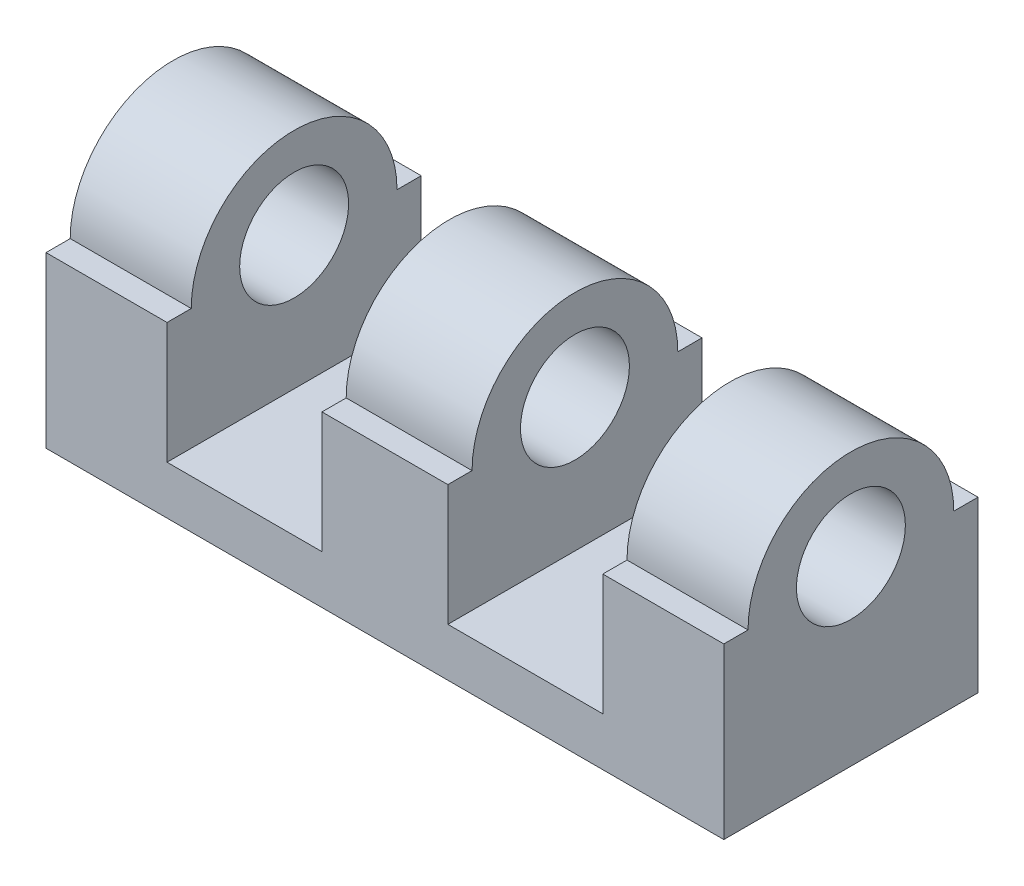
ISO-10303-21;
HEADER;
FILE_DESCRIPTION(('STEP AP214'),'2;1');
FILE_NAME('part.step','',(''),(''),'','','');
FILE_SCHEMA(('AUTOMOTIVE_DESIGN { 1 0 10303 214 1 1 1 1 }'));
ENDSEC;
DATA;
#1=APPLICATION_CONTEXT('core data for automotive mechanical design processes');
#2=APPLICATION_PROTOCOL_DEFINITION('international standard','automotive_design',2000,#1);
#3=PRODUCT_CONTEXT('',#1,'mechanical');
#4=PRODUCT('Part','Part','',(#3));
#5=PRODUCT_RELATED_PRODUCT_CATEGORY('part','',(#4));
#6=PRODUCT_DEFINITION_FORMATION('','',#4);
#7=PRODUCT_DEFINITION_CONTEXT('part definition',#1,'design');
#8=PRODUCT_DEFINITION('design','',#6,#7);
#9=PRODUCT_DEFINITION_SHAPE('','',#8);
#10=(LENGTH_UNIT() NAMED_UNIT(*) SI_UNIT(.MILLI.,.METRE.));
#11=(NAMED_UNIT(*) PLANE_ANGLE_UNIT() SI_UNIT($,.RADIAN.));
#12=(NAMED_UNIT(*) SI_UNIT($,.STERADIAN.) SOLID_ANGLE_UNIT());
#13=UNCERTAINTY_MEASURE_WITH_UNIT(LENGTH_MEASURE(1.E-05),#10,'distance_accuracy_value','');
#14=(GEOMETRIC_REPRESENTATION_CONTEXT(3) GLOBAL_UNCERTAINTY_ASSIGNED_CONTEXT((#13)) GLOBAL_UNIT_ASSIGNED_CONTEXT((#10,
#11,#12)) REPRESENTATION_CONTEXT('',''));
#15=CARTESIAN_POINT('',(0.,0.,0.));
#16=DIRECTION('',(0.,0.,1.));
#17=DIRECTION('',(1.,0.,0.));
#18=AXIS2_PLACEMENT_3D('',#15,#16,#17);
#19=CARTESIAN_POINT('',(-9.,3.5,-7.25));
#20=DIRECTION('',(0.,-1.,0.));
#21=DIRECTION('',(0.,0.,-1.));
#22=AXIS2_PLACEMENT_3D('',#19,#20,#21);
#23=PLANE('',#22);
#24=DIRECTION('',(0.,0.,1.));
#25=VECTOR('',#24,1.);
#26=CARTESIAN_POINT('',(9.,3.5,-7.25));
#27=LINE('',#26,#25);
#28=CARTESIAN_POINT('',(9.,3.5,-5.25));
#29=VERTEX_POINT('',#28);
#30=CARTESIAN_POINT('',(9.,3.5,5.25));
#31=VERTEX_POINT('',#30);
#32=EDGE_CURVE('E242',#29,#31,#27,.T.);
#33=ORIENTED_EDGE('',*,*,#32,.F.);
#34=DIRECTION('',(-1.,0.,0.));
#35=VECTOR('',#34,1.);
#36=CARTESIAN_POINT('',(-9.,3.5,-5.25));
#37=LINE('',#36,#35);
#38=CARTESIAN_POINT('',(2.6,3.5,-5.25));
#39=VERTEX_POINT('',#38);
#40=EDGE_CURVE('E618',#29,#39,#37,.T.);
#41=ORIENTED_EDGE('',*,*,#40,.T.);
#42=DIRECTION('',(0.,0.,-1.));
#43=VECTOR('',#42,1.);
#44=CARTESIAN_POINT('',(2.6,3.5,7.25));
#45=LINE('',#44,#43);
#46=CARTESIAN_POINT('',(2.6,3.5,5.25000000000001));
#47=VERTEX_POINT('',#46);
#48=EDGE_CURVE('E278',#47,#39,#45,.T.);
#49=ORIENTED_EDGE('',*,*,#48,.F.);
#50=DIRECTION('',(1.,0.,0.));
#51=VECTOR('',#50,1.);
#52=CARTESIAN_POINT('',(-9.,3.5,5.25));
#53=LINE('',#52,#51);
#54=EDGE_CURVE('E608',#47,#31,#53,.T.);
#55=ORIENTED_EDGE('',*,*,#54,.T.);
#56=EDGE_LOOP('',(#33,#41,#49,#55));
#57=FACE_BOUND('',#56,.T.);
#58=ADVANCED_FACE('F60',(#57),#23,.F.);
#59=CARTESIAN_POINT('',(14.,8.5,-7.25));
#60=DIRECTION('',(0.,-1.,0.));
#61=DIRECTION('',(0.,0.,-1.));
#62=AXIS2_PLACEMENT_3D('',#59,#60,#61);
#63=PLANE('',#62);
#64=DIRECTION('',(0.,0.,-1.));
#65=VECTOR('',#64,1.);
#66=CARTESIAN_POINT('',(-9.,8.5,-7.25));
#67=LINE('',#66,#65);
#68=CARTESIAN_POINT('',(-9.,8.5,-4.25));
#69=VERTEX_POINT('',#68);
#70=CARTESIAN_POINT('',(-9.,8.5,-5.25));
#71=VERTEX_POINT('',#70);
#72=EDGE_CURVE('E307',#69,#71,#67,.T.);
#73=ORIENTED_EDGE('',*,*,#72,.T.);
#74=DIRECTION('',(-1.,0.,0.));
#75=VECTOR('',#74,1.);
#76=CARTESIAN_POINT('',(14.,8.5,-5.25));
#77=LINE('',#76,#75);
#78=CARTESIAN_POINT('',(-14.,8.5,-5.25));
#79=VERTEX_POINT('',#78);
#80=EDGE_CURVE('E202',#71,#79,#77,.T.);
#81=ORIENTED_EDGE('',*,*,#80,.T.);
#82=DIRECTION('',(0.,0.,1.));
#83=VECTOR('',#82,1.);
#84=CARTESIAN_POINT('',(-14.,8.5,-7.25));
#85=LINE('',#84,#83);
#86=CARTESIAN_POINT('',(-14.,8.5,-4.25));
#87=VERTEX_POINT('',#86);
#88=EDGE_CURVE('E223',#79,#87,#85,.T.);
#89=ORIENTED_EDGE('',*,*,#88,.T.);
#90=DIRECTION('',(-1.,0.,0.));
#91=VECTOR('',#90,1.);
#92=CARTESIAN_POINT('',(14.,8.5,-4.25));
#93=LINE('',#92,#91);
#94=EDGE_CURVE('E234',#69,#87,#93,.T.);
#95=ORIENTED_EDGE('',*,*,#94,.F.);
#96=EDGE_LOOP('',(#73,#81,#89,#95));
#97=FACE_BOUND('',#96,.T.);
#98=ADVANCED_FACE('F340',(#97),#63,.F.);
#99=CARTESIAN_POINT('',(14.,8.5,0.));
#100=DIRECTION('',(-1.,0.,0.));
#101=DIRECTION('',(0.,0.,1.));
#102=AXIS2_PLACEMENT_3D('',#99,#100,#101);
#103=CYLINDRICAL_SURFACE('',#102,4.25);
#104=DIRECTION('',(-1.,0.,0.));
#105=VECTOR('',#104,1.);
#106=CARTESIAN_POINT('',(14.,8.5,4.25));
#107=LINE('',#106,#105);
#108=CARTESIAN_POINT('',(-9.,8.5,4.25));
#109=VERTEX_POINT('',#108);
#110=CARTESIAN_POINT('',(-14.,8.5,4.25));
#111=VERTEX_POINT('',#110);
#112=EDGE_CURVE('E222',#109,#111,#107,.T.);
#113=ORIENTED_EDGE('',*,*,#112,.F.);
#114=CARTESIAN_POINT('',(-9.,8.5,0.));
#115=DIRECTION('',(-1.,0.,0.));
#116=DIRECTION('',(0.,0.,1.));
#117=AXIS2_PLACEMENT_3D('',#114,#115,#116);
#118=CIRCLE('',#117,4.25);
#119=EDGE_CURVE('E304',#109,#69,#118,.T.);
#120=ORIENTED_EDGE('',*,*,#119,.T.);
#121=ORIENTED_EDGE('',*,*,#94,.T.);
#122=CARTESIAN_POINT('',(-14.,8.5,0.));
#123=DIRECTION('',(1.,0.,0.));
#124=DIRECTION('',(0.,0.,1.));
#125=AXIS2_PLACEMENT_3D('',#122,#123,#124);
#126=CIRCLE('',#125,4.25);
#127=EDGE_CURVE('E225',#87,#111,#126,.T.);
#128=ORIENTED_EDGE('',*,*,#127,.T.);
#129=EDGE_LOOP('',(#113,#120,#121,#128));
#130=FACE_BOUND('',#129,.T.);
#131=ADVANCED_FACE('F330',(#130),#103,.T.);
#132=CARTESIAN_POINT('',(14.,8.5,7.25));
#133=DIRECTION('',(0.,-1.,0.));
#134=DIRECTION('',(0.,0.,-1.));
#135=AXIS2_PLACEMENT_3D('',#132,#133,#134);
#136=PLANE('',#135);
#137=DIRECTION('',(0.,0.,1.));
#138=VECTOR('',#137,1.);
#139=CARTESIAN_POINT('',(-14.,8.5,7.25));
#140=LINE('',#139,#138);
#141=CARTESIAN_POINT('',(-14.,8.5,5.25));
#142=VERTEX_POINT('',#141);
#143=EDGE_CURVE('E213',#111,#142,#140,.T.);
#144=ORIENTED_EDGE('',*,*,#143,.T.);
#145=DIRECTION('',(-1.,0.,0.));
#146=VECTOR('',#145,1.);
#147=CARTESIAN_POINT('',(14.,8.5,5.25));
#148=LINE('',#147,#146);
#149=CARTESIAN_POINT('',(-9.,8.5,5.25));
#150=VERTEX_POINT('',#149);
#151=EDGE_CURVE('E589',#150,#142,#148,.T.);
#152=ORIENTED_EDGE('',*,*,#151,.F.);
#153=DIRECTION('',(0.,0.,-1.));
#154=VECTOR('',#153,1.);
#155=CARTESIAN_POINT('',(-9.,8.5,7.25));
#156=LINE('',#155,#154);
#157=EDGE_CURVE('E245',#150,#109,#156,.T.);
#158=ORIENTED_EDGE('',*,*,#157,.T.);
#159=ORIENTED_EDGE('',*,*,#112,.T.);
#160=EDGE_LOOP('',(#144,#152,#158,#159));
#161=FACE_BOUND('',#160,.T.);
#162=ADVANCED_FACE('F319',(#161),#136,.F.);
#163=CARTESIAN_POINT('',(14.,9.,0.));
#164=DIRECTION('',(-1.,0.,0.));
#165=DIRECTION('',(0.,0.,1.));
#166=AXIS2_PLACEMENT_3D('',#163,#164,#165);
#167=CYLINDRICAL_SURFACE('',#166,2.25);
#168=CARTESIAN_POINT('',(-9.,9.,0.));
#169=DIRECTION('',(-1.,0.,0.));
#170=DIRECTION('',(0.,0.,1.));
#171=AXIS2_PLACEMENT_3D('',#168,#169,#170);
#172=CIRCLE('',#171,2.25);
#173=CARTESIAN_POINT('',(-9.,9.,2.25));
#174=VERTEX_POINT('',#173);
#175=EDGE_CURVE('E243',#174,#174,#172,.T.);
#176=ORIENTED_EDGE('',*,*,#175,.F.);
#177=EDGE_LOOP('',(#176));
#178=FACE_BOUND('',#177,.T.);
#179=CARTESIAN_POINT('',(-14.,9.,0.));
#180=DIRECTION('',(1.,0.,0.));
#181=DIRECTION('',(0.,0.,-1.));
#182=AXIS2_PLACEMENT_3D('',#179,#180,#181);
#183=CIRCLE('',#182,2.25);
#184=CARTESIAN_POINT('',(-14.,9.,-2.25));
#185=VERTEX_POINT('',#184);
#186=EDGE_CURVE('E216',#185,#185,#183,.T.);
#187=ORIENTED_EDGE('',*,*,#186,.F.);
#188=EDGE_LOOP('',(#187));
#189=FACE_BOUND('',#188,.T.);
#190=ADVANCED_FACE('F317',(#178,#189),#167,.F.);
#191=CARTESIAN_POINT('',(14.,8.5,0.));
#192=DIRECTION('',(-1.,0.,0.));
#193=DIRECTION('',(0.,0.,1.));
#194=AXIS2_PLACEMENT_3D('',#191,#192,#193);
#195=PLANE('',#194);
#196=DIRECTION('',(0.,0.,-1.));
#197=VECTOR('',#196,1.);
#198=CARTESIAN_POINT('',(14.,1.5,-2.25));
#199=LINE('',#198,#197);
#200=CARTESIAN_POINT('',(14.,1.5,5.25000000000001));
#201=VERTEX_POINT('',#200);
#202=CARTESIAN_POINT('',(14.,1.5,-5.25));
#203=VERTEX_POINT('',#202);
#204=EDGE_CURVE('E199',#201,#203,#199,.T.);
#205=ORIENTED_EDGE('',*,*,#204,.T.);
#206=DIRECTION('',(0.,1.,0.));
#207=VECTOR('',#206,1.);
#208=CARTESIAN_POINT('',(14.,8.5,-5.25));
#209=LINE('',#208,#207);
#210=CARTESIAN_POINT('',(14.,8.5,-5.25));
#211=VERTEX_POINT('',#210);
#212=EDGE_CURVE('E182',#203,#211,#209,.T.);
#213=ORIENTED_EDGE('',*,*,#212,.T.);
#214=DIRECTION('',(0.,0.,1.));
#215=VECTOR('',#214,1.);
#216=CARTESIAN_POINT('',(14.,8.5,-7.25));
#217=LINE('',#216,#215);
#218=CARTESIAN_POINT('',(14.,8.5,-4.25));
#219=VERTEX_POINT('',#218);
#220=EDGE_CURVE('E209',#211,#219,#217,.T.);
#221=ORIENTED_EDGE('',*,*,#220,.T.);
#222=CARTESIAN_POINT('',(14.,8.5,0.));
#223=DIRECTION('',(1.,0.,0.));
#224=DIRECTION('',(0.,0.,1.));
#225=AXIS2_PLACEMENT_3D('',#222,#223,#224);
#226=CIRCLE('',#225,4.25);
#227=CARTESIAN_POINT('',(14.,8.5,4.25));
#228=VERTEX_POINT('',#227);
#229=EDGE_CURVE('E211',#219,#228,#226,.T.);
#230=ORIENTED_EDGE('',*,*,#229,.T.);
#231=DIRECTION('',(0.,0.,1.));
#232=VECTOR('',#231,1.);
#233=CARTESIAN_POINT('',(14.,8.5,7.25));
#234=LINE('',#233,#232);
#235=CARTESIAN_POINT('',(14.,8.5,5.25));
#236=VERTEX_POINT('',#235);
#237=EDGE_CURVE('E220',#228,#236,#234,.T.);
#238=ORIENTED_EDGE('',*,*,#237,.T.);
#239=DIRECTION('',(0.,-1.,0.));
#240=VECTOR('',#239,1.);
#241=CARTESIAN_POINT('',(14.,8.5,5.25));
#242=LINE('',#241,#240);
#243=EDGE_CURVE('E208',#236,#201,#242,.T.);
#244=ORIENTED_EDGE('',*,*,#243,.T.);
#245=EDGE_LOOP('',(#205,#213,#221,#230,#238,#244));
#246=FACE_BOUND('',#245,.T.);
#247=CARTESIAN_POINT('',(14.,9.,0.));
#248=DIRECTION('',(1.,0.,0.));
#249=DIRECTION('',(0.,0.,-1.));
#250=AXIS2_PLACEMENT_3D('',#247,#248,#249);
#251=CIRCLE('',#250,2.25);
#252=CARTESIAN_POINT('',(14.,9.,-2.25));
#253=VERTEX_POINT('',#252);
#254=EDGE_CURVE('E226',#253,#253,#251,.T.);
#255=ORIENTED_EDGE('',*,*,#254,.F.);
#256=EDGE_LOOP('',(#255));
#257=FACE_BOUND('',#256,.T.);
#258=ADVANCED_FACE('F205',(#246,#257),#195,.F.);
#259=CARTESIAN_POINT('',(-14.,8.5,0.));
#260=DIRECTION('',(-1.,0.,0.));
#261=DIRECTION('',(0.,0.,1.));
#262=AXIS2_PLACEMENT_3D('',#259,#260,#261);
#263=PLANE('',#262);
#264=DIRECTION('',(0.,1.,0.));
#265=VECTOR('',#264,1.);
#266=CARTESIAN_POINT('',(-14.,8.5,-5.25));
#267=LINE('',#266,#265);
#268=CARTESIAN_POINT('',(-14.,1.5,-5.25));
#269=VERTEX_POINT('',#268);
#270=EDGE_CURVE('E192',#269,#79,#267,.T.);
#271=ORIENTED_EDGE('',*,*,#270,.F.);
#272=DIRECTION('',(0.,0.,-1.));
#273=VECTOR('',#272,1.);
#274=CARTESIAN_POINT('',(-14.,1.5,2.25));
#275=LINE('',#274,#273);
#276=CARTESIAN_POINT('',(-14.,1.5,5.25000000000001));
#277=VERTEX_POINT('',#276);
#278=EDGE_CURVE('E201',#277,#269,#275,.T.);
#279=ORIENTED_EDGE('',*,*,#278,.F.);
#280=DIRECTION('',(0.,-1.,0.));
#281=VECTOR('',#280,1.);
#282=CARTESIAN_POINT('',(-14.,8.5,5.25));
#283=LINE('',#282,#281);
#284=EDGE_CURVE('E596',#142,#277,#283,.T.);
#285=ORIENTED_EDGE('',*,*,#284,.F.);
#286=ORIENTED_EDGE('',*,*,#143,.F.);
#287=ORIENTED_EDGE('',*,*,#127,.F.);
#288=ORIENTED_EDGE('',*,*,#88,.F.);
#289=EDGE_LOOP('',(#271,#279,#285,#286,#287,#288));
#290=FACE_BOUND('',#289,.T.);
#291=ORIENTED_EDGE('',*,*,#186,.T.);
#292=EDGE_LOOP('',(#291));
#293=FACE_BOUND('',#292,.T.);
#294=ADVANCED_FACE('F315',(#290,#293),#263,.T.);
#295=ORIENTED_EDGE('',*,*,#220,.F.);
#296=CARTESIAN_POINT('',(9.,8.5,-5.25));
#297=VERTEX_POINT('',#296);
#298=EDGE_CURVE('E188',#211,#297,#77,.T.);
#299=ORIENTED_EDGE('',*,*,#298,.T.);
#300=DIRECTION('',(0.,0.,1.));
#301=VECTOR('',#300,1.);
#302=CARTESIAN_POINT('',(9.,8.5,-7.25));
#303=LINE('',#302,#301);
#304=CARTESIAN_POINT('',(9.,8.5,-4.25));
#305=VERTEX_POINT('',#304);
#306=EDGE_CURVE('E246',#297,#305,#303,.T.);
#307=ORIENTED_EDGE('',*,*,#306,.T.);
#308=EDGE_CURVE('E235',#219,#305,#93,.T.);
#309=ORIENTED_EDGE('',*,*,#308,.F.);
#310=EDGE_LOOP('',(#295,#299,#307,#309));
#311=FACE_BOUND('',#310,.T.);
#312=ADVANCED_FACE('F62',(#311),#63,.F.);
#313=CARTESIAN_POINT('',(9.,8.5,0.));
#314=DIRECTION('',(1.,0.,0.));
#315=DIRECTION('',(0.,0.,-1.));
#316=AXIS2_PLACEMENT_3D('',#313,#314,#315);
#317=CIRCLE('',#316,4.25);
#318=CARTESIAN_POINT('',(9.,8.5,4.25));
#319=VERTEX_POINT('',#318);
#320=EDGE_CURVE('E300',#305,#319,#317,.T.);
#321=ORIENTED_EDGE('',*,*,#320,.T.);
#322=EDGE_CURVE('E231',#228,#319,#107,.T.);
#323=ORIENTED_EDGE('',*,*,#322,.F.);
#324=ORIENTED_EDGE('',*,*,#229,.F.);
#325=ORIENTED_EDGE('',*,*,#308,.T.);
#326=EDGE_LOOP('',(#321,#323,#324,#325));
#327=FACE_BOUND('',#326,.T.);
#328=ADVANCED_FACE('F476',(#327),#103,.T.);
#329=DIRECTION('',(0.,0.,1.));
#330=VECTOR('',#329,1.);
#331=CARTESIAN_POINT('',(9.,8.5,7.25));
#332=LINE('',#331,#330);
#333=CARTESIAN_POINT('',(9.,8.5,5.25));
#334=VERTEX_POINT('',#333);
#335=EDGE_CURVE('E241',#319,#334,#332,.T.);
#336=ORIENTED_EDGE('',*,*,#335,.T.);
#337=EDGE_CURVE('E599',#236,#334,#148,.T.);
#338=ORIENTED_EDGE('',*,*,#337,.F.);
#339=ORIENTED_EDGE('',*,*,#237,.F.);
#340=ORIENTED_EDGE('',*,*,#322,.T.);
#341=EDGE_LOOP('',(#336,#338,#339,#340));
#342=FACE_BOUND('',#341,.T.);
#343=ADVANCED_FACE('F333',(#342),#136,.F.);
#344=CARTESIAN_POINT('',(14.,1.5,2.25));
#345=DIRECTION('',(0.,1.,0.));
#346=DIRECTION('',(0.,0.,1.));
#347=AXIS2_PLACEMENT_3D('',#344,#345,#346);
#348=PLANE('',#347);
#349=ORIENTED_EDGE('',*,*,#278,.T.);
#350=DIRECTION('',(-1.,0.,0.));
#351=VECTOR('',#350,1.);
#352=CARTESIAN_POINT('',(14.,1.5,-5.25));
#353=LINE('',#352,#351);
#354=EDGE_CURVE('E185',#203,#269,#353,.T.);
#355=ORIENTED_EDGE('',*,*,#354,.F.);
#356=ORIENTED_EDGE('',*,*,#204,.F.);
#357=DIRECTION('',(-1.,0.,0.));
#358=VECTOR('',#357,1.);
#359=CARTESIAN_POINT('',(14.,1.5,5.25000000000001));
#360=LINE('',#359,#358);
#361=EDGE_CURVE('E602',#201,#277,#360,.T.);
#362=ORIENTED_EDGE('',*,*,#361,.T.);
#363=EDGE_LOOP('',(#349,#355,#356,#362));
#364=FACE_BOUND('',#363,.T.);
#365=ADVANCED_FACE('F197',(#364),#348,.F.);
#366=CARTESIAN_POINT('',(9.,9.,0.));
#367=DIRECTION('',(1.,0.,0.));
#368=DIRECTION('',(0.,0.,-1.));
#369=AXIS2_PLACEMENT_3D('',#366,#367,#368);
#370=CIRCLE('',#369,2.25);
#371=CARTESIAN_POINT('',(9.,9.,-2.25));
#372=VERTEX_POINT('',#371);
#373=EDGE_CURVE('E238',#372,#372,#370,.T.);
#374=ORIENTED_EDGE('',*,*,#373,.F.);
#375=EDGE_LOOP('',(#374));
#376=FACE_BOUND('',#375,.T.);
#377=ORIENTED_EDGE('',*,*,#254,.T.);
#378=EDGE_LOOP('',(#377));
#379=FACE_BOUND('',#378,.T.);
#380=ADVANCED_FACE('F322',(#376,#379),#167,.F.);
#381=CARTESIAN_POINT('',(-9.,12.75,-7.25));
#382=DIRECTION('',(-1.,0.,0.));
#383=DIRECTION('',(0.,0.,1.));
#384=AXIS2_PLACEMENT_3D('',#381,#382,#383);
#385=PLANE('',#384);
#386=ORIENTED_EDGE('',*,*,#175,.T.);
#387=EDGE_LOOP('',(#386));
#388=FACE_BOUND('',#387,.T.);
#389=DIRECTION('',(0.,0.,1.));
#390=VECTOR('',#389,1.);
#391=CARTESIAN_POINT('',(-9.,3.5,-7.25));
#392=LINE('',#391,#390);
#393=CARTESIAN_POINT('',(-9.,3.5,-5.25));
#394=VERTEX_POINT('',#393);
#395=CARTESIAN_POINT('',(-9.,3.5,5.25));
#396=VERTEX_POINT('',#395);
#397=EDGE_CURVE('E261',#394,#396,#392,.T.);
#398=ORIENTED_EDGE('',*,*,#397,.F.);
#399=DIRECTION('',(0.,1.,0.));
#400=VECTOR('',#399,1.);
#401=CARTESIAN_POINT('',(-9.,12.75,-5.25));
#402=LINE('',#401,#400);
#403=EDGE_CURVE('E592',#394,#71,#402,.T.);
#404=ORIENTED_EDGE('',*,*,#403,.T.);
#405=ORIENTED_EDGE('',*,*,#72,.F.);
#406=ORIENTED_EDGE('',*,*,#119,.F.);
#407=ORIENTED_EDGE('',*,*,#157,.F.);
#408=DIRECTION('',(0.,-1.,0.));
#409=VECTOR('',#408,1.);
#410=CARTESIAN_POINT('',(-9.,12.75,5.25));
#411=LINE('',#410,#409);
#412=EDGE_CURVE('E262',#150,#396,#411,.T.);
#413=ORIENTED_EDGE('',*,*,#412,.T.);
#414=EDGE_LOOP('',(#398,#404,#405,#406,#407,#413));
#415=FACE_BOUND('',#414,.T.);
#416=ADVANCED_FACE('F337',(#388,#415),#385,.F.);
#417=CARTESIAN_POINT('',(9.,12.75,-7.25));
#418=DIRECTION('',(1.,0.,0.));
#419=DIRECTION('',(0.,0.,-1.));
#420=AXIS2_PLACEMENT_3D('',#417,#418,#419);
#421=PLANE('',#420);
#422=ORIENTED_EDGE('',*,*,#373,.T.);
#423=EDGE_LOOP('',(#422));
#424=FACE_BOUND('',#423,.T.);
#425=ORIENTED_EDGE('',*,*,#306,.F.);
#426=DIRECTION('',(0.,-1.,0.));
#427=VECTOR('',#426,1.);
#428=CARTESIAN_POINT('',(9.,12.75,-5.25));
#429=LINE('',#428,#427);
#430=EDGE_CURVE('E621',#297,#29,#429,.T.);
#431=ORIENTED_EDGE('',*,*,#430,.T.);
#432=ORIENTED_EDGE('',*,*,#32,.T.);
#433=DIRECTION('',(0.,1.,0.));
#434=VECTOR('',#433,1.);
#435=CARTESIAN_POINT('',(9.,12.75,5.25));
#436=LINE('',#435,#434);
#437=EDGE_CURVE('E611',#31,#334,#436,.T.);
#438=ORIENTED_EDGE('',*,*,#437,.T.);
#439=ORIENTED_EDGE('',*,*,#335,.F.);
#440=ORIENTED_EDGE('',*,*,#320,.F.);
#441=EDGE_LOOP('',(#425,#431,#432,#438,#439,#440));
#442=FACE_BOUND('',#441,.T.);
#443=ADVANCED_FACE('F352',(#424,#442),#421,.F.);
#444=DIRECTION('',(0.,0.,-1.));
#445=VECTOR('',#444,1.);
#446=CARTESIAN_POINT('',(-2.6,3.5,7.25));
#447=LINE('',#446,#445);
#448=CARTESIAN_POINT('',(-2.6,3.5,5.25000000000001));
#449=VERTEX_POINT('',#448);
#450=CARTESIAN_POINT('',(-2.6,3.5,-5.25));
#451=VERTEX_POINT('',#450);
#452=EDGE_CURVE('E259',#449,#451,#447,.T.);
#453=ORIENTED_EDGE('',*,*,#452,.T.);
#454=DIRECTION('',(-1.,0.,0.));
#455=VECTOR('',#454,1.);
#456=CARTESIAN_POINT('',(-9.,3.5,-5.25));
#457=LINE('',#456,#455);
#458=EDGE_CURVE('E82',#451,#394,#457,.T.);
#459=ORIENTED_EDGE('',*,*,#458,.T.);
#460=ORIENTED_EDGE('',*,*,#397,.T.);
#461=DIRECTION('',(1.,0.,0.));
#462=VECTOR('',#461,1.);
#463=CARTESIAN_POINT('',(-9.,3.5,5.25));
#464=LINE('',#463,#462);
#465=EDGE_CURVE('E249',#396,#449,#464,.T.);
#466=ORIENTED_EDGE('',*,*,#465,.T.);
#467=EDGE_LOOP('',(#453,#459,#460,#466));
#468=FACE_BOUND('',#467,.T.);
#469=ADVANCED_FACE('F258',(#468),#23,.F.);
#470=CARTESIAN_POINT('',(26.1992005628169,8.5,-7.25));
#471=DIRECTION('',(0.,-1.,0.));
#472=DIRECTION('',(0.,0.,-1.));
#473=AXIS2_PLACEMENT_3D('',#470,#471,#472);
#474=PLANE('',#473);
#475=DIRECTION('',(0.,0.,1.));
#476=VECTOR('',#475,1.);
#477=CARTESIAN_POINT('',(2.6,8.5,-7.25));
#478=LINE('',#477,#476);
#479=CARTESIAN_POINT('',(2.6,8.5,-5.25));
#480=VERTEX_POINT('',#479);
#481=CARTESIAN_POINT('',(2.6,8.5,-4.25));
#482=VERTEX_POINT('',#481);
#483=EDGE_CURVE('E276',#480,#482,#478,.T.);
#484=ORIENTED_EDGE('',*,*,#483,.F.);
#485=CARTESIAN_POINT('',(-2.6,8.5,-5.25));
#486=VERTEX_POINT('',#485);
#487=EDGE_CURVE('E636',#480,#486,#77,.T.);
#488=ORIENTED_EDGE('',*,*,#487,.T.);
#489=DIRECTION('',(0.,0.,1.));
#490=VECTOR('',#489,1.);
#491=CARTESIAN_POINT('',(-2.6,8.5,-7.25));
#492=LINE('',#491,#490);
#493=CARTESIAN_POINT('',(-2.6,8.5,-4.25));
#494=VERTEX_POINT('',#493);
#495=EDGE_CURVE('E268',#486,#494,#492,.T.);
#496=ORIENTED_EDGE('',*,*,#495,.T.);
#497=DIRECTION('',(-1.,0.,0.));
#498=VECTOR('',#497,1.);
#499=CARTESIAN_POINT('',(26.1992005628169,8.5,-4.25));
#500=LINE('',#499,#498);
#501=EDGE_CURVE('E288',#482,#494,#500,.T.);
#502=ORIENTED_EDGE('',*,*,#501,.F.);
#503=EDGE_LOOP('',(#484,#488,#496,#502));
#504=FACE_BOUND('',#503,.T.);
#505=ADVANCED_FACE('F351',(#504),#474,.F.);
#506=CARTESIAN_POINT('',(26.1992005628169,8.5,4.25));
#507=DIRECTION('',(0.,-1.,0.));
#508=DIRECTION('',(0.,0.,-1.));
#509=AXIS2_PLACEMENT_3D('',#506,#507,#508);
#510=PLANE('',#509);
#511=DIRECTION('',(0.,0.,1.));
#512=VECTOR('',#511,1.);
#513=CARTESIAN_POINT('',(-2.6,8.5,4.25));
#514=LINE('',#513,#512);
#515=CARTESIAN_POINT('',(-2.6,8.5,4.25));
#516=VERTEX_POINT('',#515);
#517=CARTESIAN_POINT('',(-2.6,8.5,5.25));
#518=VERTEX_POINT('',#517);
#519=EDGE_CURVE('E267',#516,#518,#514,.T.);
#520=ORIENTED_EDGE('',*,*,#519,.T.);
#521=CARTESIAN_POINT('',(2.6,8.5,5.25));
#522=VERTEX_POINT('',#521);
#523=EDGE_CURVE('E75',#522,#518,#148,.T.);
#524=ORIENTED_EDGE('',*,*,#523,.F.);
#525=DIRECTION('',(0.,0.,1.));
#526=VECTOR('',#525,1.);
#527=CARTESIAN_POINT('',(2.6,8.5,4.25));
#528=LINE('',#527,#526);
#529=CARTESIAN_POINT('',(2.6,8.5,4.25));
#530=VERTEX_POINT('',#529);
#531=EDGE_CURVE('E282',#530,#522,#528,.T.);
#532=ORIENTED_EDGE('',*,*,#531,.F.);
#533=DIRECTION('',(-1.,0.,0.));
#534=VECTOR('',#533,1.);
#535=CARTESIAN_POINT('',(26.1992005628169,8.5,4.25));
#536=LINE('',#535,#534);
#537=EDGE_CURVE('E291',#530,#516,#536,.T.);
#538=ORIENTED_EDGE('',*,*,#537,.T.);
#539=EDGE_LOOP('',(#520,#524,#532,#538));
#540=FACE_BOUND('',#539,.T.);
#541=ADVANCED_FACE('F357',(#540),#510,.F.);
#542=CARTESIAN_POINT('',(26.1992005628169,8.5,0.));
#543=DIRECTION('',(-1.,0.,0.));
#544=DIRECTION('',(0.,0.,1.));
#545=AXIS2_PLACEMENT_3D('',#542,#543,#544);
#546=CYLINDRICAL_SURFACE('',#545,4.25);
#547=CARTESIAN_POINT('',(2.6,8.5,0.));
#548=DIRECTION('',(1.,0.,0.));
#549=DIRECTION('',(0.,0.,-1.));
#550=AXIS2_PLACEMENT_3D('',#547,#548,#549);
#551=CIRCLE('',#550,4.25);
#552=EDGE_CURVE('E285',#482,#530,#551,.T.);
#553=ORIENTED_EDGE('',*,*,#552,.F.);
#554=ORIENTED_EDGE('',*,*,#501,.T.);
#555=CARTESIAN_POINT('',(-2.6,8.5,0.));
#556=DIRECTION('',(-1.,0.,0.));
#557=DIRECTION('',(0.,0.,1.));
#558=AXIS2_PLACEMENT_3D('',#555,#556,#557);
#559=CIRCLE('',#558,4.25);
#560=EDGE_CURVE('E272',#494,#516,#559,.F.);
#561=ORIENTED_EDGE('',*,*,#560,.T.);
#562=ORIENTED_EDGE('',*,*,#537,.F.);
#563=EDGE_LOOP('',(#553,#554,#561,#562));
#564=FACE_BOUND('',#563,.T.);
#565=ADVANCED_FACE('F367',(#564),#546,.T.);
#566=CARTESIAN_POINT('',(26.1992005628169,9.,0.));
#567=DIRECTION('',(-1.,0.,0.));
#568=DIRECTION('',(0.,0.,1.));
#569=AXIS2_PLACEMENT_3D('',#566,#567,#568);
#570=CYLINDRICAL_SURFACE('',#569,2.25);
#571=CARTESIAN_POINT('',(2.6,9.,0.));
#572=DIRECTION('',(1.,0.,0.));
#573=DIRECTION('',(0.,0.,-1.));
#574=AXIS2_PLACEMENT_3D('',#571,#572,#573);
#575=CIRCLE('',#574,2.25);
#576=CARTESIAN_POINT('',(2.6,9.,-2.25));
#577=VERTEX_POINT('',#576);
#578=EDGE_CURVE('E279',#577,#577,#575,.T.);
#579=ORIENTED_EDGE('',*,*,#578,.T.);
#580=EDGE_LOOP('',(#579));
#581=FACE_BOUND('',#580,.T.);
#582=CARTESIAN_POINT('',(-2.6,9.,0.));
#583=DIRECTION('',(-1.,0.,0.));
#584=DIRECTION('',(0.,0.,1.));
#585=AXIS2_PLACEMENT_3D('',#582,#583,#584);
#586=CIRCLE('',#585,2.25);
#587=CARTESIAN_POINT('',(-2.6,9.,2.25));
#588=VERTEX_POINT('',#587);
#589=EDGE_CURVE('E270',#588,#588,#586,.F.);
#590=ORIENTED_EDGE('',*,*,#589,.F.);
#591=EDGE_LOOP('',(#590));
#592=FACE_BOUND('',#591,.T.);
#593=ADVANCED_FACE('F370',(#581,#592),#570,.F.);
#594=CARTESIAN_POINT('',(2.6,12.75,-7.25));
#595=DIRECTION('',(1.,0.,0.));
#596=DIRECTION('',(0.,0.,-1.));
#597=AXIS2_PLACEMENT_3D('',#594,#595,#596);
#598=PLANE('',#597);
#599=DIRECTION('',(0.,-1.,0.));
#600=VECTOR('',#599,1.);
#601=CARTESIAN_POINT('',(2.6,12.75,-5.25));
#602=LINE('',#601,#600);
#603=EDGE_CURVE('E616',#480,#39,#602,.T.);
#604=ORIENTED_EDGE('',*,*,#603,.F.);
#605=ORIENTED_EDGE('',*,*,#483,.T.);
#606=ORIENTED_EDGE('',*,*,#552,.T.);
#607=ORIENTED_EDGE('',*,*,#531,.T.);
#608=DIRECTION('',(0.,1.,0.));
#609=VECTOR('',#608,1.);
#610=CARTESIAN_POINT('',(2.6,12.75,5.25));
#611=LINE('',#610,#609);
#612=EDGE_CURVE('E606',#47,#522,#611,.T.);
#613=ORIENTED_EDGE('',*,*,#612,.F.);
#614=ORIENTED_EDGE('',*,*,#48,.T.);
#615=EDGE_LOOP('',(#604,#605,#606,#607,#613,#614));
#616=FACE_BOUND('',#615,.T.);
#617=ORIENTED_EDGE('',*,*,#578,.F.);
#618=EDGE_LOOP('',(#617));
#619=FACE_BOUND('',#618,.T.);
#620=ADVANCED_FACE('F377',(#616,#619),#598,.T.);
#621=CARTESIAN_POINT('',(-2.6,12.75,-7.25));
#622=DIRECTION('',(-1.,0.,0.));
#623=DIRECTION('',(0.,0.,1.));
#624=AXIS2_PLACEMENT_3D('',#621,#622,#623);
#625=PLANE('',#624);
#626=DIRECTION('',(0.,1.,0.));
#627=VECTOR('',#626,1.);
#628=CARTESIAN_POINT('',(-2.6,12.75,-5.25));
#629=LINE('',#628,#627);
#630=EDGE_CURVE('E15',#451,#486,#629,.T.);
#631=ORIENTED_EDGE('',*,*,#630,.F.);
#632=ORIENTED_EDGE('',*,*,#452,.F.);
#633=DIRECTION('',(0.,-1.,0.));
#634=VECTOR('',#633,1.);
#635=CARTESIAN_POINT('',(-2.6,12.75,5.25));
#636=LINE('',#635,#634);
#637=EDGE_CURVE('E68',#518,#449,#636,.T.);
#638=ORIENTED_EDGE('',*,*,#637,.F.);
#639=ORIENTED_EDGE('',*,*,#519,.F.);
#640=ORIENTED_EDGE('',*,*,#560,.F.);
#641=ORIENTED_EDGE('',*,*,#495,.F.);
#642=EDGE_LOOP('',(#631,#632,#638,#639,#640,#641));
#643=FACE_BOUND('',#642,.T.);
#644=ORIENTED_EDGE('',*,*,#589,.T.);
#645=EDGE_LOOP('',(#644));
#646=FACE_BOUND('',#645,.T.);
#647=ADVANCED_FACE('F264',(#643,#646),#625,.T.);
#648=CARTESIAN_POINT('',(14.,8.5,5.25));
#649=DIRECTION('',(0.,0.,-1.));
#650=DIRECTION('',(0.,1.,0.));
#651=AXIS2_PLACEMENT_3D('',#648,#649,#650);
#652=PLANE('',#651);
#653=ORIENTED_EDGE('',*,*,#54,.F.);
#654=ORIENTED_EDGE('',*,*,#612,.T.);
#655=ORIENTED_EDGE('',*,*,#523,.T.);
#656=ORIENTED_EDGE('',*,*,#637,.T.);
#657=ORIENTED_EDGE('',*,*,#465,.F.);
#658=ORIENTED_EDGE('',*,*,#412,.F.);
#659=ORIENTED_EDGE('',*,*,#151,.T.);
#660=ORIENTED_EDGE('',*,*,#284,.T.);
#661=ORIENTED_EDGE('',*,*,#361,.F.);
#662=ORIENTED_EDGE('',*,*,#243,.F.);
#663=ORIENTED_EDGE('',*,*,#337,.T.);
#664=ORIENTED_EDGE('',*,*,#437,.F.);
#665=EDGE_LOOP('',(#653,#654,#655,#656,#657,#658,#659,#660,#661,#662,#663,#664));
#666=FACE_BOUND('',#665,.T.);
#667=ADVANCED_FACE('F248',(#666),#652,.F.);
#668=CARTESIAN_POINT('',(14.,8.5,-5.25));
#669=DIRECTION('',(0.,0.,1.));
#670=DIRECTION('',(1.,0.,0.));
#671=AXIS2_PLACEMENT_3D('',#668,#669,#670);
#672=PLANE('',#671);
#673=ORIENTED_EDGE('',*,*,#298,.F.);
#674=ORIENTED_EDGE('',*,*,#212,.F.);
#675=ORIENTED_EDGE('',*,*,#354,.T.);
#676=ORIENTED_EDGE('',*,*,#270,.T.);
#677=ORIENTED_EDGE('',*,*,#80,.F.);
#678=ORIENTED_EDGE('',*,*,#403,.F.);
#679=ORIENTED_EDGE('',*,*,#458,.F.);
#680=ORIENTED_EDGE('',*,*,#630,.T.);
#681=ORIENTED_EDGE('',*,*,#487,.F.);
#682=ORIENTED_EDGE('',*,*,#603,.T.);
#683=ORIENTED_EDGE('',*,*,#40,.F.);
#684=ORIENTED_EDGE('',*,*,#430,.F.);
#685=EDGE_LOOP('',(#673,#674,#675,#676,#677,#678,#679,#680,#681,#682,#683,#684));
#686=FACE_BOUND('',#685,.T.);
#687=ADVANCED_FACE('F184',(#686),#672,.F.);
#688=CLOSED_SHELL('',(#58,#98,#131,#162,#190,#258,#294,#312,#328,#343,#365,#380,#416,#443,#469,
#505,#541,#565,#593,#620,#647,#667,#687));
#689=MANIFOLD_SOLID_BREP('B2',#688);
#690=ADVANCED_BREP_SHAPE_REPRESENTATION('',(#18,#689),#14);
#691=SHAPE_DEFINITION_REPRESENTATION(#9,#690);
ENDSEC;
END-ISO-10303-21;
